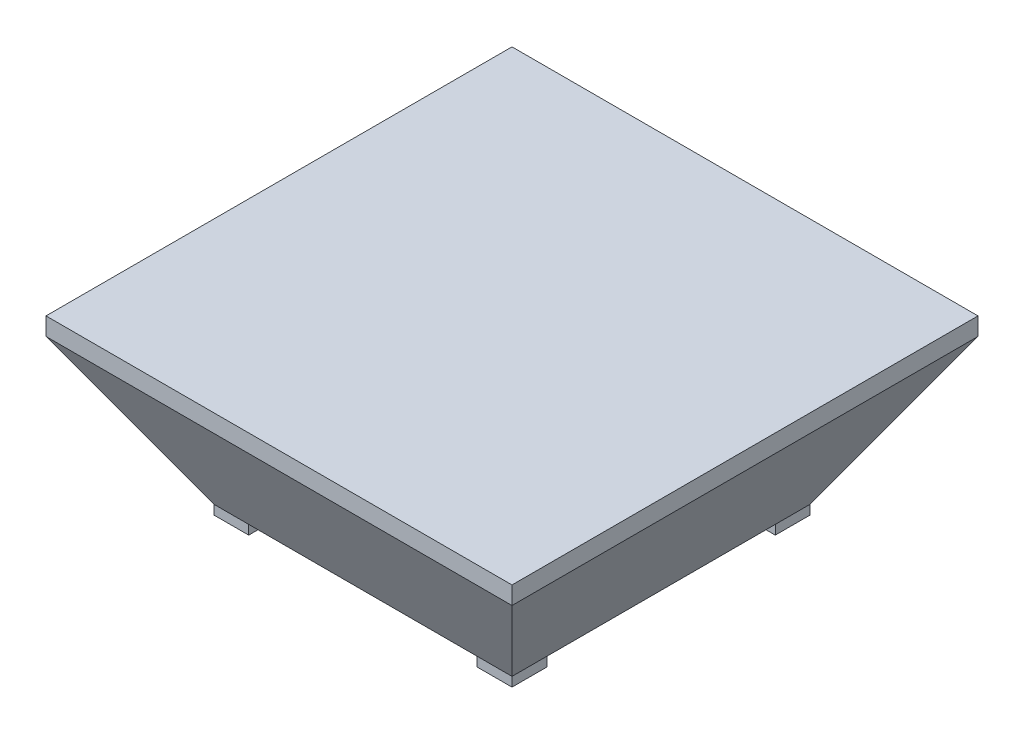
ISO-10303-21;
HEADER;
FILE_DESCRIPTION(('STEP AP214'),'2;1');
FILE_NAME('part.step','',(''),(''),'','','');
FILE_SCHEMA(('AUTOMOTIVE_DESIGN { 1 0 10303 214 1 1 1 1 }'));
ENDSEC;
DATA;
#1=APPLICATION_CONTEXT('core data for automotive mechanical design processes');
#2=APPLICATION_PROTOCOL_DEFINITION('international standard','automotive_design',2000,#1);
#3=PRODUCT_CONTEXT('',#1,'mechanical');
#4=PRODUCT('Part','Part','',(#3));
#5=PRODUCT_RELATED_PRODUCT_CATEGORY('part','',(#4));
#6=PRODUCT_DEFINITION_FORMATION('','',#4);
#7=PRODUCT_DEFINITION_CONTEXT('part definition',#1,'design');
#8=PRODUCT_DEFINITION('design','',#6,#7);
#9=PRODUCT_DEFINITION_SHAPE('','',#8);
#10=(LENGTH_UNIT() NAMED_UNIT(*) SI_UNIT(.MILLI.,.METRE.));
#11=(NAMED_UNIT(*) PLANE_ANGLE_UNIT() SI_UNIT($,.RADIAN.));
#12=(NAMED_UNIT(*) SI_UNIT($,.STERADIAN.) SOLID_ANGLE_UNIT());
#13=UNCERTAINTY_MEASURE_WITH_UNIT(LENGTH_MEASURE(1.E-05),#10,'distance_accuracy_value','');
#14=(GEOMETRIC_REPRESENTATION_CONTEXT(3) GLOBAL_UNCERTAINTY_ASSIGNED_CONTEXT((#13)) GLOBAL_UNIT_ASSIGNED_CONTEXT((#10,
#11,#12)) REPRESENTATION_CONTEXT('',''));
#15=CARTESIAN_POINT('',(0.,0.,0.));
#16=DIRECTION('',(0.,0.,1.));
#17=DIRECTION('',(1.,0.,0.));
#18=AXIS2_PLACEMENT_3D('',#15,#16,#17);
#19=CARTESIAN_POINT('',(0.,0.,0.));
#20=DIRECTION('',(0.,1.,0.));
#21=DIRECTION('',(0.,0.,1.));
#22=AXIS2_PLACEMENT_3D('',#19,#20,#21);
#23=PLANE('',#22);
#24=DIRECTION('',(0.,0.,1.));
#25=VECTOR('',#24,1.);
#26=CARTESIAN_POINT('',(-245.,0.,-245.));
#27=LINE('',#26,#25);
#28=CARTESIAN_POINT('',(-245.,0.,-319.999999999999));
#29=VERTEX_POINT('',#28);
#30=CARTESIAN_POINT('',(-245.,0.,-245.));
#31=VERTEX_POINT('',#30);
#32=EDGE_CURVE('E65',#29,#31,#27,.T.);
#33=ORIENTED_EDGE('',*,*,#32,.F.);
#34=DIRECTION('',(1.,0.,0.));
#35=VECTOR('',#34,1.);
#36=CARTESIAN_POINT('',(0.,0.,-320.));
#37=LINE('',#36,#35);
#38=CARTESIAN_POINT('',(244.999999999999,0.,-320.));
#39=VERTEX_POINT('',#38);
#40=EDGE_CURVE('E378',#29,#39,#37,.T.);
#41=ORIENTED_EDGE('',*,*,#40,.T.);
#42=DIRECTION('',(0.,0.,-1.));
#43=VECTOR('',#42,1.);
#44=CARTESIAN_POINT('',(244.999999999999,0.,-244.999999999999));
#45=LINE('',#44,#43);
#46=CARTESIAN_POINT('',(244.999999999999,0.,-244.999999999999));
#47=VERTEX_POINT('',#46);
#48=EDGE_CURVE('E205',#47,#39,#45,.T.);
#49=ORIENTED_EDGE('',*,*,#48,.F.);
#50=DIRECTION('',(-1.,0.,0.));
#51=VECTOR('',#50,1.);
#52=CARTESIAN_POINT('',(244.999999999999,0.,-244.999999999999));
#53=LINE('',#52,#51);
#54=CARTESIAN_POINT('',(320.,0.,-244.999999999999));
#55=VERTEX_POINT('',#54);
#56=EDGE_CURVE('E221',#55,#47,#53,.T.);
#57=ORIENTED_EDGE('',*,*,#56,.F.);
#58=DIRECTION('',(0.,0.,1.));
#59=VECTOR('',#58,1.);
#60=CARTESIAN_POINT('',(320.,0.,0.));
#61=LINE('',#60,#59);
#62=CARTESIAN_POINT('',(320.,0.,245.));
#63=VERTEX_POINT('',#62);
#64=EDGE_CURVE('E373',#55,#63,#61,.T.);
#65=ORIENTED_EDGE('',*,*,#64,.T.);
#66=DIRECTION('',(1.,0.,0.));
#67=VECTOR('',#66,1.);
#68=CARTESIAN_POINT('',(245.,0.,245.));
#69=LINE('',#68,#67);
#70=CARTESIAN_POINT('',(245.,0.,245.));
#71=VERTEX_POINT('',#70);
#72=EDGE_CURVE('E252',#71,#63,#69,.T.);
#73=ORIENTED_EDGE('',*,*,#72,.F.);
#74=DIRECTION('',(0.,0.,-1.));
#75=VECTOR('',#74,1.);
#76=CARTESIAN_POINT('',(245.,0.,245.));
#77=LINE('',#76,#75);
#78=CARTESIAN_POINT('',(245.,0.,320.));
#79=VERTEX_POINT('',#78);
#80=EDGE_CURVE('E258',#79,#71,#77,.T.);
#81=ORIENTED_EDGE('',*,*,#80,.F.);
#82=DIRECTION('',(-1.,0.,0.));
#83=VECTOR('',#82,1.);
#84=CARTESIAN_POINT('',(0.,0.,320.));
#85=LINE('',#84,#83);
#86=CARTESIAN_POINT('',(-245.,0.,320.));
#87=VERTEX_POINT('',#86);
#88=EDGE_CURVE('E368',#79,#87,#85,.T.);
#89=ORIENTED_EDGE('',*,*,#88,.T.);
#90=DIRECTION('',(0.,0.,1.));
#91=VECTOR('',#90,1.);
#92=CARTESIAN_POINT('',(-245.,0.,245.));
#93=LINE('',#92,#91);
#94=CARTESIAN_POINT('',(-245.,0.,245.));
#95=VERTEX_POINT('',#94);
#96=EDGE_CURVE('E312',#95,#87,#93,.T.);
#97=ORIENTED_EDGE('',*,*,#96,.F.);
#98=DIRECTION('',(1.,0.,0.));
#99=VECTOR('',#98,1.);
#100=CARTESIAN_POINT('',(-245.,0.,245.));
#101=LINE('',#100,#99);
#102=CARTESIAN_POINT('',(-320.,0.,245.));
#103=VERTEX_POINT('',#102);
#104=EDGE_CURVE('E293',#103,#95,#101,.T.);
#105=ORIENTED_EDGE('',*,*,#104,.F.);
#106=DIRECTION('',(0.,0.,-1.));
#107=VECTOR('',#106,1.);
#108=CARTESIAN_POINT('',(-320.,0.,0.));
#109=LINE('',#108,#107);
#110=CARTESIAN_POINT('',(-320.,0.,-245.));
#111=VERTEX_POINT('',#110);
#112=EDGE_CURVE('E383',#103,#111,#109,.T.);
#113=ORIENTED_EDGE('',*,*,#112,.T.);
#114=DIRECTION('',(-1.,0.,0.));
#115=VECTOR('',#114,1.);
#116=CARTESIAN_POINT('',(-245.,0.,-245.));
#117=LINE('',#116,#115);
#118=EDGE_CURVE('E60',#31,#111,#117,.T.);
#119=ORIENTED_EDGE('',*,*,#118,.F.);
#120=EDGE_LOOP('',(#33,#41,#49,#57,#65,#73,#81,#89,#97,#105,#113,#119));
#121=FACE_BOUND('',#120,.T.);
#122=ADVANCED_FACE('F41',(#121),#23,.F.);
#123=CARTESIAN_POINT('',(-500.,350.,500.));
#124=DIRECTION('',(1.,0.,0.));
#125=DIRECTION('',(0.,0.,-1.));
#126=AXIS2_PLACEMENT_3D('',#123,#124,#125);
#127=PLANE('',#126);
#128=DIRECTION('',(0.,-1.,0.));
#129=VECTOR('',#128,1.);
#130=CARTESIAN_POINT('',(-500.,350.,-500.));
#131=LINE('',#130,#129);
#132=CARTESIAN_POINT('',(-500.,350.,-500.));
#133=VERTEX_POINT('',#132);
#134=CARTESIAN_POINT('',(-500.,311.769145362398,-500.));
#135=VERTEX_POINT('',#134);
#136=EDGE_CURVE('E348',#133,#135,#131,.T.);
#137=ORIENTED_EDGE('',*,*,#136,.T.);
#138=DIRECTION('',(0.,0.,1.));
#139=VECTOR('',#138,1.);
#140=CARTESIAN_POINT('',(-500.,311.769145362398,500.));
#141=LINE('',#140,#139);
#142=CARTESIAN_POINT('',(-500.,311.769145362398,500.));
#143=VERTEX_POINT('',#142);
#144=EDGE_CURVE('E364',#135,#143,#141,.T.);
#145=ORIENTED_EDGE('',*,*,#144,.T.);
#146=DIRECTION('',(0.,-1.,0.));
#147=VECTOR('',#146,1.);
#148=CARTESIAN_POINT('',(-500.,350.,500.));
#149=LINE('',#148,#147);
#150=CARTESIAN_POINT('',(-500.,350.,500.));
#151=VERTEX_POINT('',#150);
#152=EDGE_CURVE('E360',#151,#143,#149,.T.);
#153=ORIENTED_EDGE('',*,*,#152,.F.);
#154=DIRECTION('',(0.,0.,1.));
#155=VECTOR('',#154,1.);
#156=CARTESIAN_POINT('',(-500.,350.,500.));
#157=LINE('',#156,#155);
#158=EDGE_CURVE('E335',#133,#151,#157,.T.);
#159=ORIENTED_EDGE('',*,*,#158,.F.);
#160=EDGE_LOOP('',(#137,#145,#153,#159));
#161=FACE_BOUND('',#160,.T.);
#162=ADVANCED_FACE('F442',(#161),#127,.F.);
#163=CARTESIAN_POINT('',(500.,350.,500.));
#164=DIRECTION('',(0.,0.,-1.));
#165=DIRECTION('',(-1.,0.,0.));
#166=AXIS2_PLACEMENT_3D('',#163,#164,#165);
#167=PLANE('',#166);
#168=ORIENTED_EDGE('',*,*,#152,.T.);
#169=DIRECTION('',(1.,0.,0.));
#170=VECTOR('',#169,1.);
#171=CARTESIAN_POINT('',(500.,311.769145362398,500.));
#172=LINE('',#171,#170);
#173=CARTESIAN_POINT('',(500.,311.769145362398,500.));
#174=VERTEX_POINT('',#173);
#175=EDGE_CURVE('E11',#143,#174,#172,.T.);
#176=ORIENTED_EDGE('',*,*,#175,.T.);
#177=DIRECTION('',(0.,-1.,0.));
#178=VECTOR('',#177,1.);
#179=CARTESIAN_POINT('',(500.,350.,500.));
#180=LINE('',#179,#178);
#181=CARTESIAN_POINT('',(500.,350.,500.));
#182=VERTEX_POINT('',#181);
#183=EDGE_CURVE('E356',#182,#174,#180,.T.);
#184=ORIENTED_EDGE('',*,*,#183,.F.);
#185=DIRECTION('',(1.,0.,0.));
#186=VECTOR('',#185,1.);
#187=CARTESIAN_POINT('',(500.,350.,500.));
#188=LINE('',#187,#186);
#189=EDGE_CURVE('E339',#151,#182,#188,.T.);
#190=ORIENTED_EDGE('',*,*,#189,.F.);
#191=EDGE_LOOP('',(#168,#176,#184,#190));
#192=FACE_BOUND('',#191,.T.);
#193=ADVANCED_FACE('F447',(#192),#167,.F.);
#194=CARTESIAN_POINT('',(500.,350.,500.));
#195=DIRECTION('',(-1.,0.,0.));
#196=DIRECTION('',(0.,0.,1.));
#197=AXIS2_PLACEMENT_3D('',#194,#195,#196);
#198=PLANE('',#197);
#199=ORIENTED_EDGE('',*,*,#183,.T.);
#200=DIRECTION('',(0.,0.,-1.));
#201=VECTOR('',#200,1.);
#202=CARTESIAN_POINT('',(500.,311.769145362398,500.));
#203=LINE('',#202,#201);
#204=CARTESIAN_POINT('',(500.,311.769145362398,-500.));
#205=VERTEX_POINT('',#204);
#206=EDGE_CURVE('E52',#174,#205,#203,.T.);
#207=ORIENTED_EDGE('',*,*,#206,.T.);
#208=DIRECTION('',(0.,-1.,0.));
#209=VECTOR('',#208,1.);
#210=CARTESIAN_POINT('',(500.,350.,-500.));
#211=LINE('',#210,#209);
#212=CARTESIAN_POINT('',(500.,350.,-500.));
#213=VERTEX_POINT('',#212);
#214=EDGE_CURVE('E352',#213,#205,#211,.T.);
#215=ORIENTED_EDGE('',*,*,#214,.F.);
#216=DIRECTION('',(0.,0.,-1.));
#217=VECTOR('',#216,1.);
#218=CARTESIAN_POINT('',(500.,350.,500.));
#219=LINE('',#218,#217);
#220=EDGE_CURVE('E342',#182,#213,#219,.T.);
#221=ORIENTED_EDGE('',*,*,#220,.F.);
#222=EDGE_LOOP('',(#199,#207,#215,#221));
#223=FACE_BOUND('',#222,.T.);
#224=ADVANCED_FACE('F457',(#223),#198,.F.);
#225=CARTESIAN_POINT('',(500.,350.,-500.));
#226=DIRECTION('',(0.,0.,1.));
#227=DIRECTION('',(1.,0.,0.));
#228=AXIS2_PLACEMENT_3D('',#225,#226,#227);
#229=PLANE('',#228);
#230=ORIENTED_EDGE('',*,*,#214,.T.);
#231=DIRECTION('',(-1.,0.,0.));
#232=VECTOR('',#231,1.);
#233=CARTESIAN_POINT('',(500.,311.769145362398,-500.));
#234=LINE('',#233,#232);
#235=EDGE_CURVE('E388',#205,#135,#234,.T.);
#236=ORIENTED_EDGE('',*,*,#235,.T.);
#237=ORIENTED_EDGE('',*,*,#136,.F.);
#238=DIRECTION('',(-1.,0.,0.));
#239=VECTOR('',#238,1.);
#240=CARTESIAN_POINT('',(500.,350.,-500.));
#241=LINE('',#240,#239);
#242=EDGE_CURVE('E345',#213,#133,#241,.T.);
#243=ORIENTED_EDGE('',*,*,#242,.F.);
#244=EDGE_LOOP('',(#230,#236,#237,#243));
#245=FACE_BOUND('',#244,.T.);
#246=ADVANCED_FACE('F454',(#245),#229,.F.);
#247=CARTESIAN_POINT('',(0.,350.,0.));
#248=DIRECTION('',(0.,1.,0.));
#249=DIRECTION('',(0.,0.,1.));
#250=AXIS2_PLACEMENT_3D('',#247,#248,#249);
#251=PLANE('',#250);
#252=ORIENTED_EDGE('',*,*,#158,.T.);
#253=ORIENTED_EDGE('',*,*,#189,.T.);
#254=ORIENTED_EDGE('',*,*,#220,.T.);
#255=ORIENTED_EDGE('',*,*,#242,.T.);
#256=EDGE_LOOP('',(#252,#253,#254,#255));
#257=FACE_BOUND('',#256,.T.);
#258=ADVANCED_FACE('F452',(#257),#251,.T.);
#259=CARTESIAN_POINT('',(500.,311.769145362398,500.));
#260=DIRECTION('',(-0.866025403784438,0.500000000000001,0.));
#261=DIRECTION('',(0.,0.,-1.));
#262=AXIS2_PLACEMENT_3D('',#259,#260,#261);
#263=PLANE('',#262);
#264=DIRECTION('',(0.447213595499958,0.774596669241483,0.447213595499958));
#265=VECTOR('',#264,1.);
#266=CARTESIAN_POINT('',(500.,311.769145362398,500.));
#267=LINE('',#266,#265);
#268=CARTESIAN_POINT('',(320.,0.,320.));
#269=VERTEX_POINT('',#268);
#270=EDGE_CURVE('E398',#269,#174,#267,.T.);
#271=ORIENTED_EDGE('',*,*,#270,.F.);
#272=DIRECTION('',(0.,0.,1.));
#273=VECTOR('',#272,1.);
#274=CARTESIAN_POINT('',(320.,0.,245.));
#275=LINE('',#274,#273);
#276=EDGE_CURVE('E271',#63,#269,#275,.T.);
#277=ORIENTED_EDGE('',*,*,#276,.F.);
#278=ORIENTED_EDGE('',*,*,#64,.F.);
#279=CARTESIAN_POINT('',(319.999999999999,0.,-319.999999999999));
#280=VERTEX_POINT('',#279);
#281=EDGE_CURVE('E374',#280,#55,#61,.T.);
#282=ORIENTED_EDGE('',*,*,#281,.F.);
#283=DIRECTION('',(0.447213595499958,0.774596669241483,-0.447213595499958));
#284=VECTOR('',#283,1.);
#285=CARTESIAN_POINT('',(300.,-34.6410161513777,-299.999999999999));
#286=LINE('',#285,#284);
#287=EDGE_CURVE('E46',#205,#280,#286,.F.);
#288=ORIENTED_EDGE('',*,*,#287,.F.);
#289=ORIENTED_EDGE('',*,*,#206,.F.);
#290=EDGE_LOOP('',(#271,#277,#278,#282,#288,#289));
#291=FACE_BOUND('',#290,.T.);
#292=ADVANCED_FACE('F44',(#291),#263,.F.);
#293=CARTESIAN_POINT('',(500.,311.769145362398,-500.));
#294=DIRECTION('',(0.,0.500000000000001,0.866025403784438));
#295=DIRECTION('',(-1.,0.,0.));
#296=AXIS2_PLACEMENT_3D('',#293,#294,#295);
#297=PLANE('',#296);
#298=ORIENTED_EDGE('',*,*,#287,.T.);
#299=DIRECTION('',(1.,0.,0.));
#300=VECTOR('',#299,1.);
#301=CARTESIAN_POINT('',(245.,0.,-319.999999999999));
#302=LINE('',#301,#300);
#303=EDGE_CURVE('E210',#39,#280,#302,.T.);
#304=ORIENTED_EDGE('',*,*,#303,.F.);
#305=ORIENTED_EDGE('',*,*,#40,.F.);
#306=CARTESIAN_POINT('',(-320.,0.,-320.));
#307=VERTEX_POINT('',#306);
#308=EDGE_CURVE('E379',#307,#29,#37,.T.);
#309=ORIENTED_EDGE('',*,*,#308,.F.);
#310=DIRECTION('',(-0.447213595499958,0.774596669241483,-0.447213595499958));
#311=VECTOR('',#310,1.);
#312=CARTESIAN_POINT('',(-299.999999999999,-34.6410161513776,-299.999999999999));
#313=LINE('',#312,#311);
#314=EDGE_CURVE('E395',#135,#307,#313,.F.);
#315=ORIENTED_EDGE('',*,*,#314,.F.);
#316=ORIENTED_EDGE('',*,*,#235,.F.);
#317=EDGE_LOOP('',(#298,#304,#305,#309,#315,#316));
#318=FACE_BOUND('',#317,.T.);
#319=ADVANCED_FACE('F410',(#318),#297,.F.);
#320=CARTESIAN_POINT('',(500.,311.769145362398,500.));
#321=DIRECTION('',(0.,0.500000000000001,-0.866025403784438));
#322=DIRECTION('',(1.,0.,0.));
#323=AXIS2_PLACEMENT_3D('',#320,#321,#322);
#324=PLANE('',#323);
#325=ORIENTED_EDGE('',*,*,#270,.T.);
#326=ORIENTED_EDGE('',*,*,#175,.F.);
#327=DIRECTION('',(0.447213595499958,-0.774596669241483,-0.447213595499958));
#328=VECTOR('',#327,1.);
#329=CARTESIAN_POINT('',(-300.,-34.6410161513777,300.));
#330=LINE('',#329,#328);
#331=CARTESIAN_POINT('',(-320.,0.,320.));
#332=VERTEX_POINT('',#331);
#333=EDGE_CURVE('E334',#332,#143,#330,.F.);
#334=ORIENTED_EDGE('',*,*,#333,.F.);
#335=DIRECTION('',(-1.,0.,0.));
#336=VECTOR('',#335,1.);
#337=CARTESIAN_POINT('',(-245.,0.,320.));
#338=LINE('',#337,#336);
#339=EDGE_CURVE('E299',#87,#332,#338,.T.);
#340=ORIENTED_EDGE('',*,*,#339,.F.);
#341=ORIENTED_EDGE('',*,*,#88,.F.);
#342=EDGE_CURVE('E369',#269,#79,#85,.T.);
#343=ORIENTED_EDGE('',*,*,#342,.F.);
#344=EDGE_LOOP('',(#325,#326,#334,#340,#341,#343));
#345=FACE_BOUND('',#344,.T.);
#346=ADVANCED_FACE('F473',(#345),#324,.F.);
#347=CARTESIAN_POINT('',(-500.,311.769145362398,500.));
#348=DIRECTION('',(0.866025403784438,0.500000000000001,0.));
#349=DIRECTION('',(0.,0.,1.));
#350=AXIS2_PLACEMENT_3D('',#347,#348,#349);
#351=PLANE('',#350);
#352=ORIENTED_EDGE('',*,*,#314,.T.);
#353=DIRECTION('',(0.,0.,-1.));
#354=VECTOR('',#353,1.);
#355=CARTESIAN_POINT('',(-320.,0.,-245.));
#356=LINE('',#355,#354);
#357=EDGE_CURVE('E201',#111,#307,#356,.T.);
#358=ORIENTED_EDGE('',*,*,#357,.F.);
#359=ORIENTED_EDGE('',*,*,#112,.F.);
#360=EDGE_CURVE('E384',#332,#103,#109,.T.);
#361=ORIENTED_EDGE('',*,*,#360,.F.);
#362=ORIENTED_EDGE('',*,*,#333,.T.);
#363=ORIENTED_EDGE('',*,*,#144,.F.);
#364=EDGE_LOOP('',(#352,#358,#359,#361,#362,#363));
#365=FACE_BOUND('',#364,.T.);
#366=ADVANCED_FACE('F466',(#365),#351,.F.);
#367=CARTESIAN_POINT('',(-320.,-20.,245.));
#368=DIRECTION('',(1.,0.,0.));
#369=DIRECTION('',(0.,0.,-1.));
#370=AXIS2_PLACEMENT_3D('',#367,#368,#369);
#371=PLANE('',#370);
#372=ORIENTED_EDGE('',*,*,#360,.T.);
#373=DIRECTION('',(0.,1.,0.));
#374=VECTOR('',#373,1.);
#375=CARTESIAN_POINT('',(-320.,-20.,245.));
#376=LINE('',#375,#374);
#377=CARTESIAN_POINT('',(-320.,-20.,245.));
#378=VERTEX_POINT('',#377);
#379=EDGE_CURVE('E330',#378,#103,#376,.T.);
#380=ORIENTED_EDGE('',*,*,#379,.F.);
#381=DIRECTION('',(0.,0.,-1.));
#382=VECTOR('',#381,1.);
#383=CARTESIAN_POINT('',(-320.,-20.,245.));
#384=LINE('',#383,#382);
#385=CARTESIAN_POINT('',(-320.,-20.,320.));
#386=VERTEX_POINT('',#385);
#387=EDGE_CURVE('E294',#386,#378,#384,.T.);
#388=ORIENTED_EDGE('',*,*,#387,.F.);
#389=DIRECTION('',(0.,1.,0.));
#390=VECTOR('',#389,1.);
#391=CARTESIAN_POINT('',(-320.,-20.,320.));
#392=LINE('',#391,#390);
#393=EDGE_CURVE('E308',#386,#332,#392,.T.);
#394=ORIENTED_EDGE('',*,*,#393,.T.);
#395=EDGE_LOOP('',(#372,#380,#388,#394));
#396=FACE_BOUND('',#395,.T.);
#397=ADVANCED_FACE('F472',(#396),#371,.F.);
#398=CARTESIAN_POINT('',(-245.,-20.,245.));
#399=DIRECTION('',(0.,0.,1.));
#400=DIRECTION('',(1.,0.,0.));
#401=AXIS2_PLACEMENT_3D('',#398,#399,#400);
#402=PLANE('',#401);
#403=ORIENTED_EDGE('',*,*,#104,.T.);
#404=DIRECTION('',(0.,1.,0.));
#405=VECTOR('',#404,1.);
#406=CARTESIAN_POINT('',(-245.,-20.,245.));
#407=LINE('',#406,#405);
#408=CARTESIAN_POINT('',(-245.,-20.,245.));
#409=VERTEX_POINT('',#408);
#410=EDGE_CURVE('E326',#409,#95,#407,.T.);
#411=ORIENTED_EDGE('',*,*,#410,.F.);
#412=DIRECTION('',(1.,0.,0.));
#413=VECTOR('',#412,1.);
#414=CARTESIAN_POINT('',(-245.,-20.,245.));
#415=LINE('',#414,#413);
#416=EDGE_CURVE('E298',#378,#409,#415,.T.);
#417=ORIENTED_EDGE('',*,*,#416,.F.);
#418=ORIENTED_EDGE('',*,*,#379,.T.);
#419=EDGE_LOOP('',(#403,#411,#417,#418));
#420=FACE_BOUND('',#419,.T.);
#421=ADVANCED_FACE('F519',(#420),#402,.F.);
#422=CARTESIAN_POINT('',(-245.,-20.,245.));
#423=DIRECTION('',(-1.,0.,0.));
#424=DIRECTION('',(0.,0.,1.));
#425=AXIS2_PLACEMENT_3D('',#422,#423,#424);
#426=PLANE('',#425);
#427=ORIENTED_EDGE('',*,*,#96,.T.);
#428=DIRECTION('',(0.,1.,0.));
#429=VECTOR('',#428,1.);
#430=CARTESIAN_POINT('',(-245.,-20.,320.));
#431=LINE('',#430,#429);
#432=CARTESIAN_POINT('',(-245.,-20.,320.));
#433=VERTEX_POINT('',#432);
#434=EDGE_CURVE('E322',#433,#87,#431,.T.);
#435=ORIENTED_EDGE('',*,*,#434,.F.);
#436=DIRECTION('',(0.,0.,1.));
#437=VECTOR('',#436,1.);
#438=CARTESIAN_POINT('',(-245.,-20.,245.));
#439=LINE('',#438,#437);
#440=EDGE_CURVE('E302',#409,#433,#439,.T.);
#441=ORIENTED_EDGE('',*,*,#440,.F.);
#442=ORIENTED_EDGE('',*,*,#410,.T.);
#443=EDGE_LOOP('',(#427,#435,#441,#442));
#444=FACE_BOUND('',#443,.T.);
#445=ADVANCED_FACE('F516',(#444),#426,.F.);
#446=CARTESIAN_POINT('',(-245.,-20.,320.));
#447=DIRECTION('',(0.,0.,-1.));
#448=DIRECTION('',(-1.,0.,0.));
#449=AXIS2_PLACEMENT_3D('',#446,#447,#448);
#450=PLANE('',#449);
#451=ORIENTED_EDGE('',*,*,#339,.T.);
#452=ORIENTED_EDGE('',*,*,#393,.F.);
#453=DIRECTION('',(-1.,0.,0.));
#454=VECTOR('',#453,1.);
#455=CARTESIAN_POINT('',(-245.,-20.,320.));
#456=LINE('',#455,#454);
#457=EDGE_CURVE('E305',#433,#386,#456,.T.);
#458=ORIENTED_EDGE('',*,*,#457,.F.);
#459=ORIENTED_EDGE('',*,*,#434,.T.);
#460=EDGE_LOOP('',(#451,#452,#458,#459));
#461=FACE_BOUND('',#460,.T.);
#462=ADVANCED_FACE('F505',(#461),#450,.F.);
#463=CARTESIAN_POINT('',(0.,-20.,0.));
#464=DIRECTION('',(0.,-1.,0.));
#465=DIRECTION('',(0.,0.,-1.));
#466=AXIS2_PLACEMENT_3D('',#463,#464,#465);
#467=PLANE('',#466);
#468=ORIENTED_EDGE('',*,*,#387,.T.);
#469=ORIENTED_EDGE('',*,*,#416,.T.);
#470=ORIENTED_EDGE('',*,*,#440,.T.);
#471=ORIENTED_EDGE('',*,*,#457,.T.);
#472=EDGE_LOOP('',(#468,#469,#470,#471));
#473=FACE_BOUND('',#472,.T.);
#474=ADVANCED_FACE('F512',(#473),#467,.T.);
#475=CARTESIAN_POINT('',(245.,-20.,245.));
#476=DIRECTION('',(0.,0.,1.));
#477=DIRECTION('',(1.,0.,0.));
#478=AXIS2_PLACEMENT_3D('',#475,#476,#477);
#479=PLANE('',#478);
#480=ORIENTED_EDGE('',*,*,#72,.T.);
#481=DIRECTION('',(0.,1.,0.));
#482=VECTOR('',#481,1.);
#483=CARTESIAN_POINT('',(320.,-20.,245.));
#484=LINE('',#483,#482);
#485=CARTESIAN_POINT('',(320.,-20.,245.));
#486=VERTEX_POINT('',#485);
#487=EDGE_CURVE('E289',#486,#63,#484,.T.);
#488=ORIENTED_EDGE('',*,*,#487,.F.);
#489=DIRECTION('',(1.,0.,0.));
#490=VECTOR('',#489,1.);
#491=CARTESIAN_POINT('',(245.,-20.,245.));
#492=LINE('',#491,#490);
#493=CARTESIAN_POINT('',(245.,-20.,245.));
#494=VERTEX_POINT('',#493);
#495=EDGE_CURVE('E253',#494,#486,#492,.T.);
#496=ORIENTED_EDGE('',*,*,#495,.F.);
#497=DIRECTION('',(0.,1.,0.));
#498=VECTOR('',#497,1.);
#499=CARTESIAN_POINT('',(245.,-20.,245.));
#500=LINE('',#499,#498);
#501=EDGE_CURVE('E267',#494,#71,#500,.T.);
#502=ORIENTED_EDGE('',*,*,#501,.T.);
#503=EDGE_LOOP('',(#480,#488,#496,#502));
#504=FACE_BOUND('',#503,.T.);
#505=ADVANCED_FACE('F532',(#504),#479,.F.);
#506=CARTESIAN_POINT('',(320.,-20.,245.));
#507=DIRECTION('',(-1.,0.,0.));
#508=DIRECTION('',(0.,0.,1.));
#509=AXIS2_PLACEMENT_3D('',#506,#507,#508);
#510=PLANE('',#509);
#511=ORIENTED_EDGE('',*,*,#276,.T.);
#512=DIRECTION('',(0.,1.,0.));
#513=VECTOR('',#512,1.);
#514=CARTESIAN_POINT('',(320.,-20.,320.));
#515=LINE('',#514,#513);
#516=CARTESIAN_POINT('',(320.,-20.,320.));
#517=VERTEX_POINT('',#516);
#518=EDGE_CURVE('E285',#517,#269,#515,.T.);
#519=ORIENTED_EDGE('',*,*,#518,.F.);
#520=DIRECTION('',(0.,0.,1.));
#521=VECTOR('',#520,1.);
#522=CARTESIAN_POINT('',(320.,-20.,245.));
#523=LINE('',#522,#521);
#524=EDGE_CURVE('E257',#486,#517,#523,.T.);
#525=ORIENTED_EDGE('',*,*,#524,.F.);
#526=ORIENTED_EDGE('',*,*,#487,.T.);
#527=EDGE_LOOP('',(#511,#519,#525,#526));
#528=FACE_BOUND('',#527,.T.);
#529=ADVANCED_FACE('F535',(#528),#510,.F.);
#530=CARTESIAN_POINT('',(245.,-20.,320.));
#531=DIRECTION('',(0.,0.,-1.));
#532=DIRECTION('',(-1.,0.,0.));
#533=AXIS2_PLACEMENT_3D('',#530,#531,#532);
#534=PLANE('',#533);
#535=ORIENTED_EDGE('',*,*,#342,.T.);
#536=DIRECTION('',(0.,1.,0.));
#537=VECTOR('',#536,1.);
#538=CARTESIAN_POINT('',(245.,-20.,320.));
#539=LINE('',#538,#537);
#540=CARTESIAN_POINT('',(245.,-20.,320.));
#541=VERTEX_POINT('',#540);
#542=EDGE_CURVE('E281',#541,#79,#539,.T.);
#543=ORIENTED_EDGE('',*,*,#542,.F.);
#544=DIRECTION('',(-1.,0.,0.));
#545=VECTOR('',#544,1.);
#546=CARTESIAN_POINT('',(245.,-20.,320.));
#547=LINE('',#546,#545);
#548=EDGE_CURVE('E261',#517,#541,#547,.T.);
#549=ORIENTED_EDGE('',*,*,#548,.F.);
#550=ORIENTED_EDGE('',*,*,#518,.T.);
#551=EDGE_LOOP('',(#535,#543,#549,#550));
#552=FACE_BOUND('',#551,.T.);
#553=ADVANCED_FACE('F539',(#552),#534,.F.);
#554=CARTESIAN_POINT('',(245.,-20.,245.));
#555=DIRECTION('',(1.,0.,0.));
#556=DIRECTION('',(0.,0.,-1.));
#557=AXIS2_PLACEMENT_3D('',#554,#555,#556);
#558=PLANE('',#557);
#559=ORIENTED_EDGE('',*,*,#80,.T.);
#560=ORIENTED_EDGE('',*,*,#501,.F.);
#561=DIRECTION('',(0.,0.,-1.));
#562=VECTOR('',#561,1.);
#563=CARTESIAN_POINT('',(245.,-20.,245.));
#564=LINE('',#563,#562);
#565=EDGE_CURVE('E264',#541,#494,#564,.T.);
#566=ORIENTED_EDGE('',*,*,#565,.F.);
#567=ORIENTED_EDGE('',*,*,#542,.T.);
#568=EDGE_LOOP('',(#559,#560,#566,#567));
#569=FACE_BOUND('',#568,.T.);
#570=ADVANCED_FACE('F543',(#569),#558,.F.);
#571=CARTESIAN_POINT('',(0.,-20.,0.));
#572=DIRECTION('',(0.,-1.,0.));
#573=DIRECTION('',(0.,0.,-1.));
#574=AXIS2_PLACEMENT_3D('',#571,#572,#573);
#575=PLANE('',#574);
#576=ORIENTED_EDGE('',*,*,#495,.T.);
#577=ORIENTED_EDGE('',*,*,#524,.T.);
#578=ORIENTED_EDGE('',*,*,#548,.T.);
#579=ORIENTED_EDGE('',*,*,#565,.T.);
#580=EDGE_LOOP('',(#576,#577,#578,#579));
#581=FACE_BOUND('',#580,.T.);
#582=ADVANCED_FACE('F547',(#581),#575,.T.);
#583=CARTESIAN_POINT('',(244.999999999999,-20.,-244.999999999999));
#584=DIRECTION('',(1.,0.,0.));
#585=DIRECTION('',(0.,0.,-1.));
#586=AXIS2_PLACEMENT_3D('',#583,#584,#585);
#587=PLANE('',#586);
#588=ORIENTED_EDGE('',*,*,#48,.T.);
#589=DIRECTION('',(0.,1.,0.));
#590=VECTOR('',#589,1.);
#591=CARTESIAN_POINT('',(245.,-20.,-319.999999999999));
#592=LINE('',#591,#590);
#593=CARTESIAN_POINT('',(245.,-20.,-319.999999999999));
#594=VERTEX_POINT('',#593);
#595=EDGE_CURVE('E248',#594,#39,#592,.T.);
#596=ORIENTED_EDGE('',*,*,#595,.F.);
#597=DIRECTION('',(0.,0.,-1.));
#598=VECTOR('',#597,1.);
#599=CARTESIAN_POINT('',(244.999999999999,-20.,-244.999999999999));
#600=LINE('',#599,#598);
#601=CARTESIAN_POINT('',(244.999999999999,-20.,-244.999999999999));
#602=VERTEX_POINT('',#601);
#603=EDGE_CURVE('E216',#602,#594,#600,.T.);
#604=ORIENTED_EDGE('',*,*,#603,.F.);
#605=DIRECTION('',(0.,1.,0.));
#606=VECTOR('',#605,1.);
#607=CARTESIAN_POINT('',(244.999999999999,-20.,-244.999999999999));
#608=LINE('',#607,#606);
#609=EDGE_CURVE('E229',#602,#47,#608,.T.);
#610=ORIENTED_EDGE('',*,*,#609,.T.);
#611=EDGE_LOOP('',(#588,#596,#604,#610));
#612=FACE_BOUND('',#611,.T.);
#613=ADVANCED_FACE('F430',(#612),#587,.F.);
#614=CARTESIAN_POINT('',(245.,-20.,-319.999999999999));
#615=DIRECTION('',(0.,0.,1.));
#616=DIRECTION('',(1.,0.,0.));
#617=AXIS2_PLACEMENT_3D('',#614,#615,#616);
#618=PLANE('',#617);
#619=ORIENTED_EDGE('',*,*,#303,.T.);
#620=DIRECTION('',(0.,1.,0.));
#621=VECTOR('',#620,1.);
#622=CARTESIAN_POINT('',(319.999999999999,-20.,-319.999999999999));
#623=LINE('',#622,#621);
#624=CARTESIAN_POINT('',(319.999999999999,-20.,-319.999999999999));
#625=VERTEX_POINT('',#624);
#626=EDGE_CURVE('E244',#625,#280,#623,.T.);
#627=ORIENTED_EDGE('',*,*,#626,.F.);
#628=DIRECTION('',(1.,0.,0.));
#629=VECTOR('',#628,1.);
#630=CARTESIAN_POINT('',(245.,-20.,-319.999999999999));
#631=LINE('',#630,#629);
#632=EDGE_CURVE('E220',#594,#625,#631,.T.);
#633=ORIENTED_EDGE('',*,*,#632,.F.);
#634=ORIENTED_EDGE('',*,*,#595,.T.);
#635=EDGE_LOOP('',(#619,#627,#633,#634));
#636=FACE_BOUND('',#635,.T.);
#637=ADVANCED_FACE('F420',(#636),#618,.F.);
#638=CARTESIAN_POINT('',(319.999999999999,-20.,-244.999999999999));
#639=DIRECTION('',(-1.,0.,0.));
#640=DIRECTION('',(0.,0.,1.));
#641=AXIS2_PLACEMENT_3D('',#638,#639,#640);
#642=PLANE('',#641);
#643=ORIENTED_EDGE('',*,*,#281,.T.);
#644=DIRECTION('',(0.,1.,0.));
#645=VECTOR('',#644,1.);
#646=CARTESIAN_POINT('',(319.999999999999,-20.,-244.999999999999));
#647=LINE('',#646,#645);
#648=CARTESIAN_POINT('',(319.999999999999,-20.,-244.999999999999));
#649=VERTEX_POINT('',#648);
#650=EDGE_CURVE('E240',#649,#55,#647,.T.);
#651=ORIENTED_EDGE('',*,*,#650,.F.);
#652=DIRECTION('',(0.,0.,1.));
#653=VECTOR('',#652,1.);
#654=CARTESIAN_POINT('',(319.999999999999,-20.,-244.999999999999));
#655=LINE('',#654,#653);
#656=EDGE_CURVE('E224',#625,#649,#655,.T.);
#657=ORIENTED_EDGE('',*,*,#656,.F.);
#658=ORIENTED_EDGE('',*,*,#626,.T.);
#659=EDGE_LOOP('',(#643,#651,#657,#658));
#660=FACE_BOUND('',#659,.T.);
#661=ADVANCED_FACE('F423',(#660),#642,.F.);
#662=CARTESIAN_POINT('',(244.999999999999,-20.,-244.999999999999));
#663=DIRECTION('',(0.,0.,-1.));
#664=DIRECTION('',(-1.,0.,0.));
#665=AXIS2_PLACEMENT_3D('',#662,#663,#664);
#666=PLANE('',#665);
#667=ORIENTED_EDGE('',*,*,#56,.T.);
#668=ORIENTED_EDGE('',*,*,#609,.F.);
#669=DIRECTION('',(-1.,0.,0.));
#670=VECTOR('',#669,1.);
#671=CARTESIAN_POINT('',(244.999999999999,-20.,-244.999999999999));
#672=LINE('',#671,#670);
#673=EDGE_CURVE('E227',#649,#602,#672,.T.);
#674=ORIENTED_EDGE('',*,*,#673,.F.);
#675=ORIENTED_EDGE('',*,*,#650,.T.);
#676=EDGE_LOOP('',(#667,#668,#674,#675));
#677=FACE_BOUND('',#676,.T.);
#678=ADVANCED_FACE('F432',(#677),#666,.F.);
#679=CARTESIAN_POINT('',(0.,-20.,0.));
#680=DIRECTION('',(0.,-1.,0.));
#681=DIRECTION('',(0.,0.,-1.));
#682=AXIS2_PLACEMENT_3D('',#679,#680,#681);
#683=PLANE('',#682);
#684=ORIENTED_EDGE('',*,*,#603,.T.);
#685=ORIENTED_EDGE('',*,*,#632,.T.);
#686=ORIENTED_EDGE('',*,*,#656,.T.);
#687=ORIENTED_EDGE('',*,*,#673,.T.);
#688=EDGE_LOOP('',(#684,#685,#686,#687));
#689=FACE_BOUND('',#688,.T.);
#690=ADVANCED_FACE('F426',(#689),#683,.T.);
#691=CARTESIAN_POINT('',(-245.,-20.,-245.));
#692=DIRECTION('',(-1.,0.,0.));
#693=DIRECTION('',(0.,0.,1.));
#694=AXIS2_PLACEMENT_3D('',#691,#692,#693);
#695=PLANE('',#694);
#696=ORIENTED_EDGE('',*,*,#32,.T.);
#697=DIRECTION('',(0.,1.,0.));
#698=VECTOR('',#697,1.);
#699=CARTESIAN_POINT('',(-245.,-20.,-245.));
#700=LINE('',#699,#698);
#701=CARTESIAN_POINT('',(-245.,-20.,-245.));
#702=VERTEX_POINT('',#701);
#703=EDGE_CURVE('E184',#702,#31,#700,.T.);
#704=ORIENTED_EDGE('',*,*,#703,.F.);
#705=DIRECTION('',(0.,0.,1.));
#706=VECTOR('',#705,1.);
#707=CARTESIAN_POINT('',(-245.,-20.,-245.));
#708=LINE('',#707,#706);
#709=CARTESIAN_POINT('',(-245.,-20.,-320.));
#710=VERTEX_POINT('',#709);
#711=EDGE_CURVE('E191',#710,#702,#708,.T.);
#712=ORIENTED_EDGE('',*,*,#711,.F.);
#713=DIRECTION('',(0.,1.,0.));
#714=VECTOR('',#713,1.);
#715=CARTESIAN_POINT('',(-245.,-20.,-320.));
#716=LINE('',#715,#714);
#717=EDGE_CURVE('E622',#710,#29,#716,.T.);
#718=ORIENTED_EDGE('',*,*,#717,.T.);
#719=EDGE_LOOP('',(#696,#704,#712,#718));
#720=FACE_BOUND('',#719,.T.);
#721=ADVANCED_FACE('F203',(#720),#695,.F.);
#722=CARTESIAN_POINT('',(-245.,-20.,-245.));
#723=DIRECTION('',(0.,0.,-1.));
#724=DIRECTION('',(-1.,0.,0.));
#725=AXIS2_PLACEMENT_3D('',#722,#723,#724);
#726=PLANE('',#725);
#727=ORIENTED_EDGE('',*,*,#118,.T.);
#728=DIRECTION('',(0.,1.,0.));
#729=VECTOR('',#728,1.);
#730=CARTESIAN_POINT('',(-320.,-20.,-245.));
#731=LINE('',#730,#729);
#732=CARTESIAN_POINT('',(-320.,-20.,-245.));
#733=VERTEX_POINT('',#732);
#734=EDGE_CURVE('E186',#733,#111,#731,.T.);
#735=ORIENTED_EDGE('',*,*,#734,.F.);
#736=DIRECTION('',(-1.,0.,0.));
#737=VECTOR('',#736,1.);
#738=CARTESIAN_POINT('',(-245.,-20.,-245.));
#739=LINE('',#738,#737);
#740=EDGE_CURVE('E180',#702,#733,#739,.T.);
#741=ORIENTED_EDGE('',*,*,#740,.F.);
#742=ORIENTED_EDGE('',*,*,#703,.T.);
#743=EDGE_LOOP('',(#727,#735,#741,#742));
#744=FACE_BOUND('',#743,.T.);
#745=ADVANCED_FACE('F182',(#744),#726,.F.);
#746=CARTESIAN_POINT('',(-320.,-20.,-245.));
#747=DIRECTION('',(1.,0.,0.));
#748=DIRECTION('',(0.,0.,-1.));
#749=AXIS2_PLACEMENT_3D('',#746,#747,#748);
#750=PLANE('',#749);
#751=ORIENTED_EDGE('',*,*,#357,.T.);
#752=DIRECTION('',(0.,1.,0.));
#753=VECTOR('',#752,1.);
#754=CARTESIAN_POINT('',(-320.,-20.,-320.));
#755=LINE('',#754,#753);
#756=CARTESIAN_POINT('',(-320.,-20.,-320.));
#757=VERTEX_POINT('',#756);
#758=EDGE_CURVE('E212',#757,#307,#755,.T.);
#759=ORIENTED_EDGE('',*,*,#758,.F.);
#760=DIRECTION('',(0.,0.,-1.));
#761=VECTOR('',#760,1.);
#762=CARTESIAN_POINT('',(-320.,-20.,-245.));
#763=LINE('',#762,#761);
#764=EDGE_CURVE('E190',#733,#757,#763,.T.);
#765=ORIENTED_EDGE('',*,*,#764,.F.);
#766=ORIENTED_EDGE('',*,*,#734,.T.);
#767=EDGE_LOOP('',(#751,#759,#765,#766));
#768=FACE_BOUND('',#767,.T.);
#769=ADVANCED_FACE('F590',(#768),#750,.F.);
#770=CARTESIAN_POINT('',(-245.,-20.,-320.));
#771=DIRECTION('',(0.,0.,1.));
#772=DIRECTION('',(1.,0.,0.));
#773=AXIS2_PLACEMENT_3D('',#770,#771,#772);
#774=PLANE('',#773);
#775=ORIENTED_EDGE('',*,*,#308,.T.);
#776=ORIENTED_EDGE('',*,*,#717,.F.);
#777=DIRECTION('',(1.,0.,0.));
#778=VECTOR('',#777,1.);
#779=CARTESIAN_POINT('',(-245.,-20.,-320.));
#780=LINE('',#779,#778);
#781=EDGE_CURVE('E196',#757,#710,#780,.T.);
#782=ORIENTED_EDGE('',*,*,#781,.F.);
#783=ORIENTED_EDGE('',*,*,#758,.T.);
#784=EDGE_LOOP('',(#775,#776,#782,#783));
#785=FACE_BOUND('',#784,.T.);
#786=ADVANCED_FACE('F599',(#785),#774,.F.);
#787=CARTESIAN_POINT('',(0.,-20.,0.));
#788=DIRECTION('',(0.,1.,0.));
#789=DIRECTION('',(0.,0.,1.));
#790=AXIS2_PLACEMENT_3D('',#787,#788,#789);
#791=PLANE('',#790);
#792=ORIENTED_EDGE('',*,*,#711,.T.);
#793=ORIENTED_EDGE('',*,*,#740,.T.);
#794=ORIENTED_EDGE('',*,*,#764,.T.);
#795=ORIENTED_EDGE('',*,*,#781,.T.);
#796=EDGE_LOOP('',(#792,#793,#794,#795));
#797=FACE_BOUND('',#796,.T.);
#798=ADVANCED_FACE('F194',(#797),#791,.F.);
#799=CLOSED_SHELL('',(#122,#162,#193,#224,#246,#258,#292,#319,#346,#366,#397,#421,#445,#462,
#474,#505,#529,#553,#570,#582,#613,#637,#661,#678,#690,#721,#745,#769,#786,#798));
#800=MANIFOLD_SOLID_BREP('B2',#799);
#801=ADVANCED_BREP_SHAPE_REPRESENTATION('',(#18,#800),#14);
#802=SHAPE_DEFINITION_REPRESENTATION(#9,#801);
ENDSEC;
END-ISO-10303-21;
